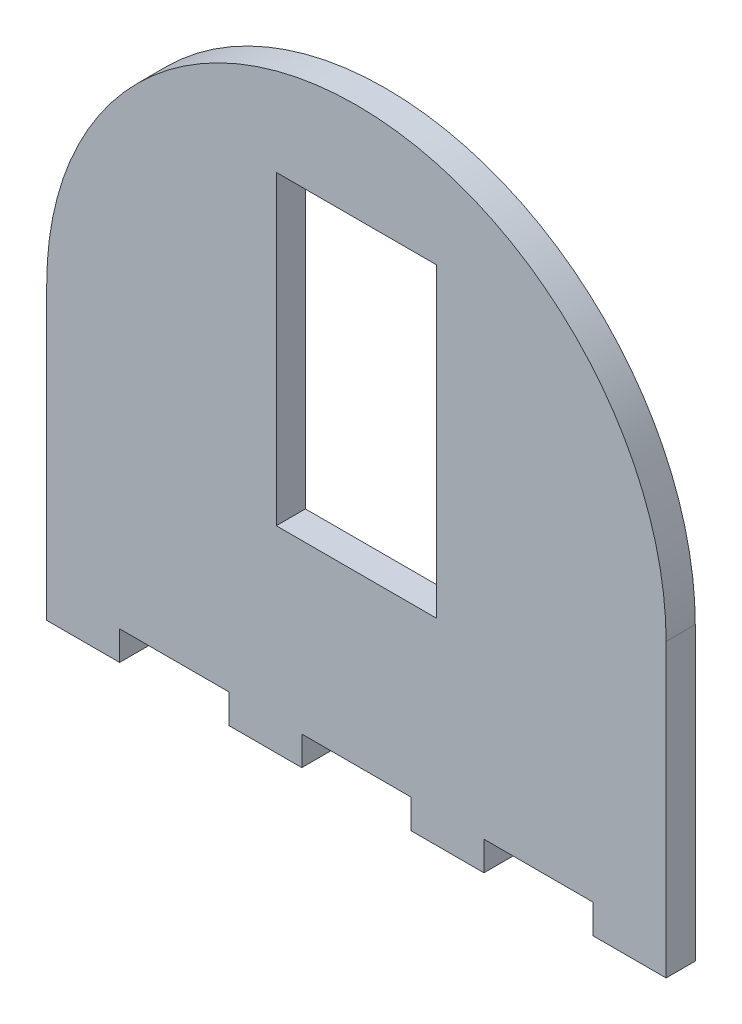
ISO-10303-21;
HEADER;
FILE_DESCRIPTION(('STEP AP214'),'2;1');
FILE_NAME('part.step','',(''),(''),'','','');
FILE_SCHEMA(('AUTOMOTIVE_DESIGN { 1 0 10303 214 1 1 1 1 }'));
ENDSEC;
DATA;
#1=APPLICATION_CONTEXT('core data for automotive mechanical design processes');
#2=APPLICATION_PROTOCOL_DEFINITION('international standard','automotive_design',2000,#1);
#3=PRODUCT_CONTEXT('',#1,'mechanical');
#4=PRODUCT('Part','Part','',(#3));
#5=PRODUCT_RELATED_PRODUCT_CATEGORY('part','',(#4));
#6=PRODUCT_DEFINITION_FORMATION('','',#4);
#7=PRODUCT_DEFINITION_CONTEXT('part definition',#1,'design');
#8=PRODUCT_DEFINITION('design','',#6,#7);
#9=PRODUCT_DEFINITION_SHAPE('','',#8);
#10=(LENGTH_UNIT() NAMED_UNIT(*) SI_UNIT(.MILLI.,.METRE.));
#11=(NAMED_UNIT(*) PLANE_ANGLE_UNIT() SI_UNIT($,.RADIAN.));
#12=(NAMED_UNIT(*) SI_UNIT($,.STERADIAN.) SOLID_ANGLE_UNIT());
#13=UNCERTAINTY_MEASURE_WITH_UNIT(LENGTH_MEASURE(1.E-05),#10,'distance_accuracy_value','');
#14=(GEOMETRIC_REPRESENTATION_CONTEXT(3) GLOBAL_UNCERTAINTY_ASSIGNED_CONTEXT((#13)) GLOBAL_UNIT_ASSIGNED_CONTEXT((#10,
#11,#12)) REPRESENTATION_CONTEXT('',''));
#15=CARTESIAN_POINT('',(0.,0.,0.));
#16=DIRECTION('',(0.,0.,1.));
#17=DIRECTION('',(1.,0.,0.));
#18=AXIS2_PLACEMENT_3D('',#15,#16,#17);
#19=CARTESIAN_POINT('',(0.,0.,4.));
#20=DIRECTION('',(1.,0.,0.));
#21=DIRECTION('',(0.,0.,-1.));
#22=AXIS2_PLACEMENT_3D('',#19,#20,#21);
#23=PLANE('',#22);
#24=DIRECTION('',(0.,-1.,0.));
#25=VECTOR('',#24,1.);
#26=CARTESIAN_POINT('',(0.,0.,0.));
#27=LINE('',#26,#25);
#28=CARTESIAN_POINT('',(0.,40.,0.));
#29=VERTEX_POINT('',#28);
#30=CARTESIAN_POINT('',(0.,0.,0.));
#31=VERTEX_POINT('',#30);
#32=EDGE_CURVE('E218',#29,#31,#27,.T.);
#33=ORIENTED_EDGE('',*,*,#32,.T.);
#34=DIRECTION('',(0.,0.,-1.));
#35=VECTOR('',#34,1.);
#36=CARTESIAN_POINT('',(0.,0.,4.));
#37=LINE('',#36,#35);
#38=CARTESIAN_POINT('',(0.,0.,4.));
#39=VERTEX_POINT('',#38);
#40=EDGE_CURVE('E11',#39,#31,#37,.T.);
#41=ORIENTED_EDGE('',*,*,#40,.F.);
#42=DIRECTION('',(0.,-1.,0.));
#43=VECTOR('',#42,1.);
#44=CARTESIAN_POINT('',(0.,0.,4.));
#45=LINE('',#44,#43);
#46=CARTESIAN_POINT('',(0.,40.,4.));
#47=VERTEX_POINT('',#46);
#48=EDGE_CURVE('E224',#47,#39,#45,.T.);
#49=ORIENTED_EDGE('',*,*,#48,.F.);
#50=DIRECTION('',(0.,0.,-1.));
#51=VECTOR('',#50,1.);
#52=CARTESIAN_POINT('',(0.,40.,4.));
#53=LINE('',#52,#51);
#54=EDGE_CURVE('E274',#47,#29,#53,.T.);
#55=ORIENTED_EDGE('',*,*,#54,.T.);
#56=EDGE_LOOP('',(#33,#41,#49,#55));
#57=FACE_BOUND('',#56,.T.);
#58=ADVANCED_FACE('F38',(#57),#23,.F.);
#59=CARTESIAN_POINT('',(0.,0.,4.));
#60=DIRECTION('',(0.,1.,0.));
#61=DIRECTION('',(0.,0.,1.));
#62=AXIS2_PLACEMENT_3D('',#59,#60,#61);
#63=PLANE('',#62);
#64=DIRECTION('',(1.,0.,0.));
#65=VECTOR('',#64,1.);
#66=CARTESIAN_POINT('',(0.,0.,0.));
#67=LINE('',#66,#65);
#68=CARTESIAN_POINT('',(10.,0.,0.));
#69=VERTEX_POINT('',#68);
#70=EDGE_CURVE('E278',#31,#69,#67,.T.);
#71=ORIENTED_EDGE('',*,*,#70,.T.);
#72=DIRECTION('',(0.,0.,-1.));
#73=VECTOR('',#72,1.);
#74=CARTESIAN_POINT('',(10.,0.,4.));
#75=LINE('',#74,#73);
#76=CARTESIAN_POINT('',(10.,0.,4.));
#77=VERTEX_POINT('',#76);
#78=EDGE_CURVE('E46',#77,#69,#75,.T.);
#79=ORIENTED_EDGE('',*,*,#78,.F.);
#80=DIRECTION('',(1.,0.,0.));
#81=VECTOR('',#80,1.);
#82=CARTESIAN_POINT('',(0.,0.,4.));
#83=LINE('',#82,#81);
#84=EDGE_CURVE('E228',#39,#77,#83,.T.);
#85=ORIENTED_EDGE('',*,*,#84,.F.);
#86=ORIENTED_EDGE('',*,*,#40,.T.);
#87=EDGE_LOOP('',(#71,#79,#85,#86));
#88=FACE_BOUND('',#87,.T.);
#89=ADVANCED_FACE('F403',(#88),#63,.F.);
#90=CARTESIAN_POINT('',(10.,0.,4.));
#91=DIRECTION('',(-1.,0.,0.));
#92=DIRECTION('',(0.,0.,1.));
#93=AXIS2_PLACEMENT_3D('',#90,#91,#92);
#94=PLANE('',#93);
#95=DIRECTION('',(0.,1.,0.));
#96=VECTOR('',#95,1.);
#97=CARTESIAN_POINT('',(10.,0.,0.));
#98=LINE('',#97,#96);
#99=CARTESIAN_POINT('',(10.,4.,0.));
#100=VERTEX_POINT('',#99);
#101=EDGE_CURVE('E281',#69,#100,#98,.T.);
#102=ORIENTED_EDGE('',*,*,#101,.T.);
#103=DIRECTION('',(0.,0.,-1.));
#104=VECTOR('',#103,1.);
#105=CARTESIAN_POINT('',(10.,4.,4.));
#106=LINE('',#105,#104);
#107=CARTESIAN_POINT('',(10.,4.,4.));
#108=VERTEX_POINT('',#107);
#109=EDGE_CURVE('E373',#108,#100,#106,.T.);
#110=ORIENTED_EDGE('',*,*,#109,.F.);
#111=DIRECTION('',(0.,1.,0.));
#112=VECTOR('',#111,1.);
#113=CARTESIAN_POINT('',(10.,0.,4.));
#114=LINE('',#113,#112);
#115=EDGE_CURVE('E232',#77,#108,#114,.T.);
#116=ORIENTED_EDGE('',*,*,#115,.F.);
#117=ORIENTED_EDGE('',*,*,#78,.T.);
#118=EDGE_LOOP('',(#102,#110,#116,#117));
#119=FACE_BOUND('',#118,.T.);
#120=ADVANCED_FACE('F382',(#119),#94,.F.);
#121=CARTESIAN_POINT('',(10.,4.,4.));
#122=DIRECTION('',(0.,1.,0.));
#123=DIRECTION('',(0.,0.,1.));
#124=AXIS2_PLACEMENT_3D('',#121,#122,#123);
#125=PLANE('',#124);
#126=DIRECTION('',(1.,0.,0.));
#127=VECTOR('',#126,1.);
#128=CARTESIAN_POINT('',(10.,4.,0.));
#129=LINE('',#128,#127);
#130=CARTESIAN_POINT('',(25.,4.,0.));
#131=VERTEX_POINT('',#130);
#132=EDGE_CURVE('E284',#100,#131,#129,.T.);
#133=ORIENTED_EDGE('',*,*,#132,.T.);
#134=DIRECTION('',(0.,0.,-1.));
#135=VECTOR('',#134,1.);
#136=CARTESIAN_POINT('',(25.,4.,4.));
#137=LINE('',#136,#135);
#138=CARTESIAN_POINT('',(25.,4.,4.));
#139=VERTEX_POINT('',#138);
#140=EDGE_CURVE('E369',#139,#131,#137,.T.);
#141=ORIENTED_EDGE('',*,*,#140,.F.);
#142=DIRECTION('',(1.,0.,0.));
#143=VECTOR('',#142,1.);
#144=CARTESIAN_POINT('',(10.,4.,4.));
#145=LINE('',#144,#143);
#146=EDGE_CURVE('E235',#108,#139,#145,.T.);
#147=ORIENTED_EDGE('',*,*,#146,.F.);
#148=ORIENTED_EDGE('',*,*,#109,.T.);
#149=EDGE_LOOP('',(#133,#141,#147,#148));
#150=FACE_BOUND('',#149,.T.);
#151=ADVANCED_FACE('F391',(#150),#125,.F.);
#152=CARTESIAN_POINT('',(25.,4.,4.));
#153=DIRECTION('',(1.,0.,0.));
#154=DIRECTION('',(0.,0.,-1.));
#155=AXIS2_PLACEMENT_3D('',#152,#153,#154);
#156=PLANE('',#155);
#157=DIRECTION('',(0.,-1.,0.));
#158=VECTOR('',#157,1.);
#159=CARTESIAN_POINT('',(25.,4.,0.));
#160=LINE('',#159,#158);
#161=CARTESIAN_POINT('',(25.,0.,0.));
#162=VERTEX_POINT('',#161);
#163=EDGE_CURVE('E287',#131,#162,#160,.T.);
#164=ORIENTED_EDGE('',*,*,#163,.T.);
#165=DIRECTION('',(0.,0.,-1.));
#166=VECTOR('',#165,1.);
#167=CARTESIAN_POINT('',(25.,0.,4.));
#168=LINE('',#167,#166);
#169=CARTESIAN_POINT('',(25.,0.,4.));
#170=VERTEX_POINT('',#169);
#171=EDGE_CURVE('E365',#170,#162,#168,.T.);
#172=ORIENTED_EDGE('',*,*,#171,.F.);
#173=DIRECTION('',(0.,-1.,0.));
#174=VECTOR('',#173,1.);
#175=CARTESIAN_POINT('',(25.,4.,4.));
#176=LINE('',#175,#174);
#177=EDGE_CURVE('E238',#139,#170,#176,.T.);
#178=ORIENTED_EDGE('',*,*,#177,.F.);
#179=ORIENTED_EDGE('',*,*,#140,.T.);
#180=EDGE_LOOP('',(#164,#172,#178,#179));
#181=FACE_BOUND('',#180,.T.);
#182=ADVANCED_FACE('F395',(#181),#156,.F.);
#183=CARTESIAN_POINT('',(25.,0.,4.));
#184=DIRECTION('',(0.,1.,0.));
#185=DIRECTION('',(0.,0.,1.));
#186=AXIS2_PLACEMENT_3D('',#183,#184,#185);
#187=PLANE('',#186);
#188=DIRECTION('',(1.,0.,0.));
#189=VECTOR('',#188,1.);
#190=CARTESIAN_POINT('',(25.,0.,0.));
#191=LINE('',#190,#189);
#192=CARTESIAN_POINT('',(35.,0.,0.));
#193=VERTEX_POINT('',#192);
#194=EDGE_CURVE('E290',#162,#193,#191,.T.);
#195=ORIENTED_EDGE('',*,*,#194,.T.);
#196=DIRECTION('',(0.,0.,-1.));
#197=VECTOR('',#196,1.);
#198=CARTESIAN_POINT('',(35.,0.,4.));
#199=LINE('',#198,#197);
#200=CARTESIAN_POINT('',(35.,0.,4.));
#201=VERTEX_POINT('',#200);
#202=EDGE_CURVE('E361',#201,#193,#199,.T.);
#203=ORIENTED_EDGE('',*,*,#202,.F.);
#204=DIRECTION('',(1.,0.,0.));
#205=VECTOR('',#204,1.);
#206=CARTESIAN_POINT('',(25.,0.,4.));
#207=LINE('',#206,#205);
#208=EDGE_CURVE('E241',#170,#201,#207,.T.);
#209=ORIENTED_EDGE('',*,*,#208,.F.);
#210=ORIENTED_EDGE('',*,*,#171,.T.);
#211=EDGE_LOOP('',(#195,#203,#209,#210));
#212=FACE_BOUND('',#211,.T.);
#213=ADVANCED_FACE('F456',(#212),#187,.F.);
#214=CARTESIAN_POINT('',(35.,0.,4.));
#215=DIRECTION('',(-1.,0.,0.));
#216=DIRECTION('',(0.,0.,1.));
#217=AXIS2_PLACEMENT_3D('',#214,#215,#216);
#218=PLANE('',#217);
#219=DIRECTION('',(0.,1.,0.));
#220=VECTOR('',#219,1.);
#221=CARTESIAN_POINT('',(35.,0.,0.));
#222=LINE('',#221,#220);
#223=CARTESIAN_POINT('',(35.,4.,0.));
#224=VERTEX_POINT('',#223);
#225=EDGE_CURVE('E293',#193,#224,#222,.T.);
#226=ORIENTED_EDGE('',*,*,#225,.T.);
#227=DIRECTION('',(0.,0.,-1.));
#228=VECTOR('',#227,1.);
#229=CARTESIAN_POINT('',(35.,4.,4.));
#230=LINE('',#229,#228);
#231=CARTESIAN_POINT('',(35.,4.,4.));
#232=VERTEX_POINT('',#231);
#233=EDGE_CURVE('E357',#232,#224,#230,.T.);
#234=ORIENTED_EDGE('',*,*,#233,.F.);
#235=DIRECTION('',(0.,1.,0.));
#236=VECTOR('',#235,1.);
#237=CARTESIAN_POINT('',(35.,0.,4.));
#238=LINE('',#237,#236);
#239=EDGE_CURVE('E244',#201,#232,#238,.T.);
#240=ORIENTED_EDGE('',*,*,#239,.F.);
#241=ORIENTED_EDGE('',*,*,#202,.T.);
#242=EDGE_LOOP('',(#226,#234,#240,#241));
#243=FACE_BOUND('',#242,.T.);
#244=ADVANCED_FACE('F453',(#243),#218,.F.);
#245=CARTESIAN_POINT('',(35.,4.,4.));
#246=DIRECTION('',(0.,1.,0.));
#247=DIRECTION('',(0.,0.,1.));
#248=AXIS2_PLACEMENT_3D('',#245,#246,#247);
#249=PLANE('',#248);
#250=DIRECTION('',(1.,0.,0.));
#251=VECTOR('',#250,1.);
#252=CARTESIAN_POINT('',(35.,4.,0.));
#253=LINE('',#252,#251);
#254=CARTESIAN_POINT('',(50.,4.,0.));
#255=VERTEX_POINT('',#254);
#256=EDGE_CURVE('E296',#224,#255,#253,.T.);
#257=ORIENTED_EDGE('',*,*,#256,.T.);
#258=DIRECTION('',(0.,0.,-1.));
#259=VECTOR('',#258,1.);
#260=CARTESIAN_POINT('',(50.,4.,4.));
#261=LINE('',#260,#259);
#262=CARTESIAN_POINT('',(50.,4.,4.));
#263=VERTEX_POINT('',#262);
#264=EDGE_CURVE('E353',#263,#255,#261,.T.);
#265=ORIENTED_EDGE('',*,*,#264,.F.);
#266=DIRECTION('',(1.,0.,0.));
#267=VECTOR('',#266,1.);
#268=CARTESIAN_POINT('',(35.,4.,4.));
#269=LINE('',#268,#267);
#270=EDGE_CURVE('E247',#232,#263,#269,.T.);
#271=ORIENTED_EDGE('',*,*,#270,.F.);
#272=ORIENTED_EDGE('',*,*,#233,.T.);
#273=EDGE_LOOP('',(#257,#265,#271,#272));
#274=FACE_BOUND('',#273,.T.);
#275=ADVANCED_FACE('F449',(#274),#249,.F.);
#276=CARTESIAN_POINT('',(50.,4.,4.));
#277=DIRECTION('',(1.,0.,0.));
#278=DIRECTION('',(0.,0.,-1.));
#279=AXIS2_PLACEMENT_3D('',#276,#277,#278);
#280=PLANE('',#279);
#281=DIRECTION('',(0.,-1.,0.));
#282=VECTOR('',#281,1.);
#283=CARTESIAN_POINT('',(50.,4.,0.));
#284=LINE('',#283,#282);
#285=CARTESIAN_POINT('',(50.,0.,0.));
#286=VERTEX_POINT('',#285);
#287=EDGE_CURVE('E299',#255,#286,#284,.T.);
#288=ORIENTED_EDGE('',*,*,#287,.T.);
#289=DIRECTION('',(0.,0.,-1.));
#290=VECTOR('',#289,1.);
#291=CARTESIAN_POINT('',(50.,0.,4.));
#292=LINE('',#291,#290);
#293=CARTESIAN_POINT('',(50.,0.,4.));
#294=VERTEX_POINT('',#293);
#295=EDGE_CURVE('E349',#294,#286,#292,.T.);
#296=ORIENTED_EDGE('',*,*,#295,.F.);
#297=DIRECTION('',(0.,-1.,0.));
#298=VECTOR('',#297,1.);
#299=CARTESIAN_POINT('',(50.,4.,4.));
#300=LINE('',#299,#298);
#301=EDGE_CURVE('E250',#263,#294,#300,.T.);
#302=ORIENTED_EDGE('',*,*,#301,.F.);
#303=ORIENTED_EDGE('',*,*,#264,.T.);
#304=EDGE_LOOP('',(#288,#296,#302,#303));
#305=FACE_BOUND('',#304,.T.);
#306=ADVANCED_FACE('F445',(#305),#280,.F.);
#307=CARTESIAN_POINT('',(50.,0.,4.));
#308=DIRECTION('',(0.,1.,0.));
#309=DIRECTION('',(0.,0.,1.));
#310=AXIS2_PLACEMENT_3D('',#307,#308,#309);
#311=PLANE('',#310);
#312=DIRECTION('',(1.,0.,0.));
#313=VECTOR('',#312,1.);
#314=CARTESIAN_POINT('',(50.,0.,0.));
#315=LINE('',#314,#313);
#316=CARTESIAN_POINT('',(60.,0.,0.));
#317=VERTEX_POINT('',#316);
#318=EDGE_CURVE('E302',#286,#317,#315,.T.);
#319=ORIENTED_EDGE('',*,*,#318,.T.);
#320=DIRECTION('',(0.,0.,-1.));
#321=VECTOR('',#320,1.);
#322=CARTESIAN_POINT('',(60.,0.,4.));
#323=LINE('',#322,#321);
#324=CARTESIAN_POINT('',(60.,0.,4.));
#325=VERTEX_POINT('',#324);
#326=EDGE_CURVE('E345',#325,#317,#323,.T.);
#327=ORIENTED_EDGE('',*,*,#326,.F.);
#328=DIRECTION('',(1.,0.,0.));
#329=VECTOR('',#328,1.);
#330=CARTESIAN_POINT('',(50.,0.,4.));
#331=LINE('',#330,#329);
#332=EDGE_CURVE('E253',#294,#325,#331,.T.);
#333=ORIENTED_EDGE('',*,*,#332,.F.);
#334=ORIENTED_EDGE('',*,*,#295,.T.);
#335=EDGE_LOOP('',(#319,#327,#333,#334));
#336=FACE_BOUND('',#335,.T.);
#337=ADVANCED_FACE('F440',(#336),#311,.F.);
#338=CARTESIAN_POINT('',(60.,0.,4.));
#339=DIRECTION('',(-1.,0.,0.));
#340=DIRECTION('',(0.,-1.,0.));
#341=AXIS2_PLACEMENT_3D('',#338,#339,#340);
#342=PLANE('',#341);
#343=DIRECTION('',(0.,1.,0.));
#344=VECTOR('',#343,1.);
#345=CARTESIAN_POINT('',(60.,0.,0.));
#346=LINE('',#345,#344);
#347=CARTESIAN_POINT('',(60.,4.,0.));
#348=VERTEX_POINT('',#347);
#349=EDGE_CURVE('E305',#317,#348,#346,.T.);
#350=ORIENTED_EDGE('',*,*,#349,.T.);
#351=DIRECTION('',(0.,0.,-1.));
#352=VECTOR('',#351,1.);
#353=CARTESIAN_POINT('',(60.,4.,4.));
#354=LINE('',#353,#352);
#355=CARTESIAN_POINT('',(60.,4.,4.));
#356=VERTEX_POINT('',#355);
#357=EDGE_CURVE('E341',#356,#348,#354,.T.);
#358=ORIENTED_EDGE('',*,*,#357,.F.);
#359=DIRECTION('',(0.,1.,0.));
#360=VECTOR('',#359,1.);
#361=CARTESIAN_POINT('',(60.,0.,4.));
#362=LINE('',#361,#360);
#363=EDGE_CURVE('E256',#325,#356,#362,.T.);
#364=ORIENTED_EDGE('',*,*,#363,.F.);
#365=ORIENTED_EDGE('',*,*,#326,.T.);
#366=EDGE_LOOP('',(#350,#358,#364,#365));
#367=FACE_BOUND('',#366,.T.);
#368=ADVANCED_FACE('F434',(#367),#342,.F.);
#369=CARTESIAN_POINT('',(60.,4.,4.));
#370=DIRECTION('',(0.,1.,0.));
#371=DIRECTION('',(0.,0.,1.));
#372=AXIS2_PLACEMENT_3D('',#369,#370,#371);
#373=PLANE('',#372);
#374=DIRECTION('',(1.,0.,0.));
#375=VECTOR('',#374,1.);
#376=CARTESIAN_POINT('',(60.,4.,0.));
#377=LINE('',#376,#375);
#378=CARTESIAN_POINT('',(75.,4.,0.));
#379=VERTEX_POINT('',#378);
#380=EDGE_CURVE('E308',#348,#379,#377,.T.);
#381=ORIENTED_EDGE('',*,*,#380,.T.);
#382=DIRECTION('',(0.,0.,-1.));
#383=VECTOR('',#382,1.);
#384=CARTESIAN_POINT('',(75.,4.,4.));
#385=LINE('',#384,#383);
#386=CARTESIAN_POINT('',(75.,4.,4.));
#387=VERTEX_POINT('',#386);
#388=EDGE_CURVE('E337',#387,#379,#385,.T.);
#389=ORIENTED_EDGE('',*,*,#388,.F.);
#390=DIRECTION('',(1.,0.,0.));
#391=VECTOR('',#390,1.);
#392=CARTESIAN_POINT('',(60.,4.,4.));
#393=LINE('',#392,#391);
#394=EDGE_CURVE('E259',#356,#387,#393,.T.);
#395=ORIENTED_EDGE('',*,*,#394,.F.);
#396=ORIENTED_EDGE('',*,*,#357,.T.);
#397=EDGE_LOOP('',(#381,#389,#395,#396));
#398=FACE_BOUND('',#397,.T.);
#399=ADVANCED_FACE('F430',(#398),#373,.F.);
#400=CARTESIAN_POINT('',(75.,4.,4.));
#401=DIRECTION('',(1.,0.,0.));
#402=DIRECTION('',(0.,0.,-1.));
#403=AXIS2_PLACEMENT_3D('',#400,#401,#402);
#404=PLANE('',#403);
#405=DIRECTION('',(0.,-1.,0.));
#406=VECTOR('',#405,1.);
#407=CARTESIAN_POINT('',(75.,4.,0.));
#408=LINE('',#407,#406);
#409=CARTESIAN_POINT('',(75.,0.,0.));
#410=VERTEX_POINT('',#409);
#411=EDGE_CURVE('E311',#379,#410,#408,.T.);
#412=ORIENTED_EDGE('',*,*,#411,.T.);
#413=DIRECTION('',(0.,0.,-1.));
#414=VECTOR('',#413,1.);
#415=CARTESIAN_POINT('',(75.,0.,4.));
#416=LINE('',#415,#414);
#417=CARTESIAN_POINT('',(75.,0.,4.));
#418=VERTEX_POINT('',#417);
#419=EDGE_CURVE('E333',#418,#410,#416,.T.);
#420=ORIENTED_EDGE('',*,*,#419,.F.);
#421=DIRECTION('',(0.,-1.,0.));
#422=VECTOR('',#421,1.);
#423=CARTESIAN_POINT('',(75.,4.,4.));
#424=LINE('',#423,#422);
#425=EDGE_CURVE('E262',#387,#418,#424,.T.);
#426=ORIENTED_EDGE('',*,*,#425,.F.);
#427=ORIENTED_EDGE('',*,*,#388,.T.);
#428=EDGE_LOOP('',(#412,#420,#426,#427));
#429=FACE_BOUND('',#428,.T.);
#430=ADVANCED_FACE('F425',(#429),#404,.F.);
#431=CARTESIAN_POINT('',(75.,0.,4.));
#432=DIRECTION('',(0.,1.,0.));
#433=DIRECTION('',(0.,0.,1.));
#434=AXIS2_PLACEMENT_3D('',#431,#432,#433);
#435=PLANE('',#434);
#436=DIRECTION('',(1.,0.,0.));
#437=VECTOR('',#436,1.);
#438=CARTESIAN_POINT('',(75.,0.,0.));
#439=LINE('',#438,#437);
#440=CARTESIAN_POINT('',(85.,0.,0.));
#441=VERTEX_POINT('',#440);
#442=EDGE_CURVE('E314',#410,#441,#439,.T.);
#443=ORIENTED_EDGE('',*,*,#442,.T.);
#444=DIRECTION('',(0.,0.,-1.));
#445=VECTOR('',#444,1.);
#446=CARTESIAN_POINT('',(85.,0.,4.));
#447=LINE('',#446,#445);
#448=CARTESIAN_POINT('',(85.,0.,4.));
#449=VERTEX_POINT('',#448);
#450=EDGE_CURVE('E329',#449,#441,#447,.T.);
#451=ORIENTED_EDGE('',*,*,#450,.F.);
#452=DIRECTION('',(1.,0.,0.));
#453=VECTOR('',#452,1.);
#454=CARTESIAN_POINT('',(75.,0.,4.));
#455=LINE('',#454,#453);
#456=EDGE_CURVE('E265',#418,#449,#455,.T.);
#457=ORIENTED_EDGE('',*,*,#456,.F.);
#458=ORIENTED_EDGE('',*,*,#419,.T.);
#459=EDGE_LOOP('',(#443,#451,#457,#458));
#460=FACE_BOUND('',#459,.T.);
#461=ADVANCED_FACE('F419',(#460),#435,.F.);
#462=CARTESIAN_POINT('',(85.,0.,4.));
#463=DIRECTION('',(-1.,0.,0.));
#464=DIRECTION('',(0.,0.,1.));
#465=AXIS2_PLACEMENT_3D('',#462,#463,#464);
#466=PLANE('',#465);
#467=DIRECTION('',(0.,1.,0.));
#468=VECTOR('',#467,1.);
#469=CARTESIAN_POINT('',(85.,0.,0.));
#470=LINE('',#469,#468);
#471=CARTESIAN_POINT('',(85.,40.,0.));
#472=VERTEX_POINT('',#471);
#473=EDGE_CURVE('E317',#441,#472,#470,.T.);
#474=ORIENTED_EDGE('',*,*,#473,.T.);
#475=DIRECTION('',(0.,0.,-1.));
#476=VECTOR('',#475,1.);
#477=CARTESIAN_POINT('',(85.,40.,4.));
#478=LINE('',#477,#476);
#479=CARTESIAN_POINT('',(85.,40.,4.));
#480=VERTEX_POINT('',#479);
#481=EDGE_CURVE('E325',#480,#472,#478,.T.);
#482=ORIENTED_EDGE('',*,*,#481,.F.);
#483=DIRECTION('',(0.,1.,0.));
#484=VECTOR('',#483,1.);
#485=CARTESIAN_POINT('',(85.,0.,4.));
#486=LINE('',#485,#484);
#487=EDGE_CURVE('E268',#449,#480,#486,.T.);
#488=ORIENTED_EDGE('',*,*,#487,.F.);
#489=ORIENTED_EDGE('',*,*,#450,.T.);
#490=EDGE_LOOP('',(#474,#482,#488,#489));
#491=FACE_BOUND('',#490,.T.);
#492=ADVANCED_FACE('F415',(#491),#466,.F.);
#493=CARTESIAN_POINT('',(42.5,40.,4.));
#494=DIRECTION('',(0.,0.,-1.));
#495=DIRECTION('',(-1.,0.,0.));
#496=AXIS2_PLACEMENT_3D('',#493,#494,#495);
#497=CYLINDRICAL_SURFACE('',#496,42.5);
#498=CARTESIAN_POINT('',(42.5,40.,0.));
#499=DIRECTION('',(0.,0.,1.));
#500=DIRECTION('',(-1.,0.,0.));
#501=AXIS2_PLACEMENT_3D('',#498,#499,#500);
#502=CIRCLE('',#501,42.5);
#503=EDGE_CURVE('E229',#472,#29,#502,.T.);
#504=ORIENTED_EDGE('',*,*,#503,.T.);
#505=ORIENTED_EDGE('',*,*,#54,.F.);
#506=CARTESIAN_POINT('',(42.5,40.,4.));
#507=DIRECTION('',(0.,0.,1.));
#508=DIRECTION('',(-1.,0.,0.));
#509=AXIS2_PLACEMENT_3D('',#506,#507,#508);
#510=CIRCLE('',#509,42.5);
#511=EDGE_CURVE('E271',#480,#47,#510,.T.);
#512=ORIENTED_EDGE('',*,*,#511,.F.);
#513=ORIENTED_EDGE('',*,*,#481,.T.);
#514=EDGE_LOOP('',(#504,#505,#512,#513));
#515=FACE_BOUND('',#514,.T.);
#516=ADVANCED_FACE('F410',(#515),#497,.T.);
#517=CARTESIAN_POINT('',(42.5,40.,4.));
#518=DIRECTION('',(0.,0.,-1.));
#519=DIRECTION('',(-1.,0.,0.));
#520=AXIS2_PLACEMENT_3D('',#517,#518,#519);
#521=PLANE('',#520);
#522=DIRECTION('',(1.,0.,0.));
#523=VECTOR('',#522,1.);
#524=CARTESIAN_POINT('',(31.5,27.,4.));
#525=LINE('',#524,#523);
#526=CARTESIAN_POINT('',(31.5,27.,4.));
#527=VERTEX_POINT('',#526);
#528=CARTESIAN_POINT('',(53.5,27.,4.));
#529=VERTEX_POINT('',#528);
#530=EDGE_CURVE('E209',#527,#529,#525,.T.);
#531=ORIENTED_EDGE('',*,*,#530,.F.);
#532=DIRECTION('',(0.,-1.,0.));
#533=VECTOR('',#532,1.);
#534=CARTESIAN_POINT('',(31.5,69.,4.));
#535=LINE('',#534,#533);
#536=CARTESIAN_POINT('',(31.5,69.,4.));
#537=VERTEX_POINT('',#536);
#538=EDGE_CURVE('E53',#537,#527,#535,.T.);
#539=ORIENTED_EDGE('',*,*,#538,.F.);
#540=DIRECTION('',(-1.,0.,0.));
#541=VECTOR('',#540,1.);
#542=CARTESIAN_POINT('',(31.5,69.,4.));
#543=LINE('',#542,#541);
#544=CARTESIAN_POINT('',(53.5,69.,4.));
#545=VERTEX_POINT('',#544);
#546=EDGE_CURVE('E196',#545,#537,#543,.T.);
#547=ORIENTED_EDGE('',*,*,#546,.F.);
#548=DIRECTION('',(0.,1.,0.));
#549=VECTOR('',#548,1.);
#550=CARTESIAN_POINT('',(53.5,69.,4.));
#551=LINE('',#550,#549);
#552=EDGE_CURVE('E200',#529,#545,#551,.T.);
#553=ORIENTED_EDGE('',*,*,#552,.F.);
#554=EDGE_LOOP('',(#531,#539,#547,#553));
#555=FACE_BOUND('',#554,.T.);
#556=ORIENTED_EDGE('',*,*,#48,.T.);
#557=ORIENTED_EDGE('',*,*,#84,.T.);
#558=ORIENTED_EDGE('',*,*,#115,.T.);
#559=ORIENTED_EDGE('',*,*,#146,.T.);
#560=ORIENTED_EDGE('',*,*,#177,.T.);
#561=ORIENTED_EDGE('',*,*,#208,.T.);
#562=ORIENTED_EDGE('',*,*,#239,.T.);
#563=ORIENTED_EDGE('',*,*,#270,.T.);
#564=ORIENTED_EDGE('',*,*,#301,.T.);
#565=ORIENTED_EDGE('',*,*,#332,.T.);
#566=ORIENTED_EDGE('',*,*,#363,.T.);
#567=ORIENTED_EDGE('',*,*,#394,.T.);
#568=ORIENTED_EDGE('',*,*,#425,.T.);
#569=ORIENTED_EDGE('',*,*,#456,.T.);
#570=ORIENTED_EDGE('',*,*,#487,.T.);
#571=ORIENTED_EDGE('',*,*,#511,.T.);
#572=EDGE_LOOP('',(#556,#557,#558,#559,#560,#561,#562,#563,#564,#565,#566,#567,#568,#569,#570,#571));
#573=FACE_BOUND('',#572,.T.);
#574=ADVANCED_FACE('F399',(#555,#573),#521,.F.);
#575=CARTESIAN_POINT('',(42.5,40.,0.));
#576=DIRECTION('',(0.,0.,-1.));
#577=DIRECTION('',(-1.,0.,0.));
#578=AXIS2_PLACEMENT_3D('',#575,#576,#577);
#579=PLANE('',#578);
#580=DIRECTION('',(0.,-1.,0.));
#581=VECTOR('',#580,1.);
#582=CARTESIAN_POINT('',(31.5,69.,0.));
#583=LINE('',#582,#581);
#584=CARTESIAN_POINT('',(31.5,69.,0.));
#585=VERTEX_POINT('',#584);
#586=CARTESIAN_POINT('',(31.5,27.,0.));
#587=VERTEX_POINT('',#586);
#588=EDGE_CURVE('E177',#585,#587,#583,.T.);
#589=ORIENTED_EDGE('',*,*,#588,.T.);
#590=DIRECTION('',(1.,0.,0.));
#591=VECTOR('',#590,1.);
#592=CARTESIAN_POINT('',(31.5,27.,0.));
#593=LINE('',#592,#591);
#594=CARTESIAN_POINT('',(53.5,27.,0.));
#595=VERTEX_POINT('',#594);
#596=EDGE_CURVE('E187',#587,#595,#593,.T.);
#597=ORIENTED_EDGE('',*,*,#596,.T.);
#598=DIRECTION('',(0.,1.,0.));
#599=VECTOR('',#598,1.);
#600=CARTESIAN_POINT('',(53.5,69.,0.));
#601=LINE('',#600,#599);
#602=CARTESIAN_POINT('',(53.5,69.,0.));
#603=VERTEX_POINT('',#602);
#604=EDGE_CURVE('E61',#595,#603,#601,.T.);
#605=ORIENTED_EDGE('',*,*,#604,.T.);
#606=DIRECTION('',(-1.,0.,0.));
#607=VECTOR('',#606,1.);
#608=CARTESIAN_POINT('',(31.5,69.,0.));
#609=LINE('',#608,#607);
#610=EDGE_CURVE('E184',#603,#585,#609,.T.);
#611=ORIENTED_EDGE('',*,*,#610,.T.);
#612=EDGE_LOOP('',(#589,#597,#605,#611));
#613=FACE_BOUND('',#612,.T.);
#614=ORIENTED_EDGE('',*,*,#32,.F.);
#615=ORIENTED_EDGE('',*,*,#503,.F.);
#616=ORIENTED_EDGE('',*,*,#473,.F.);
#617=ORIENTED_EDGE('',*,*,#442,.F.);
#618=ORIENTED_EDGE('',*,*,#411,.F.);
#619=ORIENTED_EDGE('',*,*,#380,.F.);
#620=ORIENTED_EDGE('',*,*,#349,.F.);
#621=ORIENTED_EDGE('',*,*,#318,.F.);
#622=ORIENTED_EDGE('',*,*,#287,.F.);
#623=ORIENTED_EDGE('',*,*,#256,.F.);
#624=ORIENTED_EDGE('',*,*,#225,.F.);
#625=ORIENTED_EDGE('',*,*,#194,.F.);
#626=ORIENTED_EDGE('',*,*,#163,.F.);
#627=ORIENTED_EDGE('',*,*,#132,.F.);
#628=ORIENTED_EDGE('',*,*,#101,.F.);
#629=ORIENTED_EDGE('',*,*,#70,.F.);
#630=EDGE_LOOP('',(#614,#615,#616,#617,#618,#619,#620,#621,#622,#623,#624,#625,#626,#627,#628,#629));
#631=FACE_BOUND('',#630,.T.);
#632=ADVANCED_FACE('F192',(#613,#631),#579,.T.);
#633=CARTESIAN_POINT('',(31.5,69.,0.));
#634=DIRECTION('',(-1.,0.,0.));
#635=DIRECTION('',(0.,0.,1.));
#636=AXIS2_PLACEMENT_3D('',#633,#634,#635);
#637=PLANE('',#636);
#638=ORIENTED_EDGE('',*,*,#538,.T.);
#639=DIRECTION('',(0.,0.,1.));
#640=VECTOR('',#639,1.);
#641=CARTESIAN_POINT('',(31.5,27.,0.));
#642=LINE('',#641,#640);
#643=EDGE_CURVE('E173',#587,#527,#642,.T.);
#644=ORIENTED_EDGE('',*,*,#643,.F.);
#645=ORIENTED_EDGE('',*,*,#588,.F.);
#646=DIRECTION('',(0.,0.,1.));
#647=VECTOR('',#646,1.);
#648=CARTESIAN_POINT('',(31.5,69.,0.));
#649=LINE('',#648,#647);
#650=EDGE_CURVE('E215',#585,#537,#649,.T.);
#651=ORIENTED_EDGE('',*,*,#650,.T.);
#652=EDGE_LOOP('',(#638,#644,#645,#651));
#653=FACE_BOUND('',#652,.T.);
#654=ADVANCED_FACE('F175',(#653),#637,.F.);
#655=CARTESIAN_POINT('',(31.5,69.,0.));
#656=DIRECTION('',(0.,1.,0.));
#657=DIRECTION('',(0.,0.,1.));
#658=AXIS2_PLACEMENT_3D('',#655,#656,#657);
#659=PLANE('',#658);
#660=ORIENTED_EDGE('',*,*,#546,.T.);
#661=ORIENTED_EDGE('',*,*,#650,.F.);
#662=ORIENTED_EDGE('',*,*,#610,.F.);
#663=DIRECTION('',(0.,0.,1.));
#664=VECTOR('',#663,1.);
#665=CARTESIAN_POINT('',(53.5,69.,0.));
#666=LINE('',#665,#664);
#667=EDGE_CURVE('E219',#603,#545,#666,.T.);
#668=ORIENTED_EDGE('',*,*,#667,.T.);
#669=EDGE_LOOP('',(#660,#661,#662,#668));
#670=FACE_BOUND('',#669,.T.);
#671=ADVANCED_FACE('F591',(#670),#659,.F.);
#672=CARTESIAN_POINT('',(53.5,69.,0.));
#673=DIRECTION('',(1.,0.,0.));
#674=DIRECTION('',(0.,1.,0.));
#675=AXIS2_PLACEMENT_3D('',#672,#673,#674);
#676=PLANE('',#675);
#677=ORIENTED_EDGE('',*,*,#552,.T.);
#678=ORIENTED_EDGE('',*,*,#667,.F.);
#679=ORIENTED_EDGE('',*,*,#604,.F.);
#680=DIRECTION('',(0.,0.,1.));
#681=VECTOR('',#680,1.);
#682=CARTESIAN_POINT('',(53.5,27.,0.));
#683=LINE('',#682,#681);
#684=EDGE_CURVE('E183',#595,#529,#683,.T.);
#685=ORIENTED_EDGE('',*,*,#684,.T.);
#686=EDGE_LOOP('',(#677,#678,#679,#685));
#687=FACE_BOUND('',#686,.T.);
#688=ADVANCED_FACE('F600',(#687),#676,.F.);
#689=CARTESIAN_POINT('',(31.5,27.,0.));
#690=DIRECTION('',(0.,-1.,0.));
#691=DIRECTION('',(0.,0.,-1.));
#692=AXIS2_PLACEMENT_3D('',#689,#690,#691);
#693=PLANE('',#692);
#694=ORIENTED_EDGE('',*,*,#530,.T.);
#695=ORIENTED_EDGE('',*,*,#684,.F.);
#696=ORIENTED_EDGE('',*,*,#596,.F.);
#697=ORIENTED_EDGE('',*,*,#643,.T.);
#698=EDGE_LOOP('',(#694,#695,#696,#697));
#699=FACE_BOUND('',#698,.T.);
#700=ADVANCED_FACE('F188',(#699),#693,.F.);
#701=CLOSED_SHELL('',(#58,#89,#120,#151,#182,#213,#244,#275,#306,#337,#368,#399,#430,#461,#492,
#516,#574,#632,#654,#671,#688,#700));
#702=MANIFOLD_SOLID_BREP('B2',#701);
#703=ADVANCED_BREP_SHAPE_REPRESENTATION('',(#18,#702),#14);
#704=SHAPE_DEFINITION_REPRESENTATION(#9,#703);
ENDSEC;
END-ISO-10303-21;
